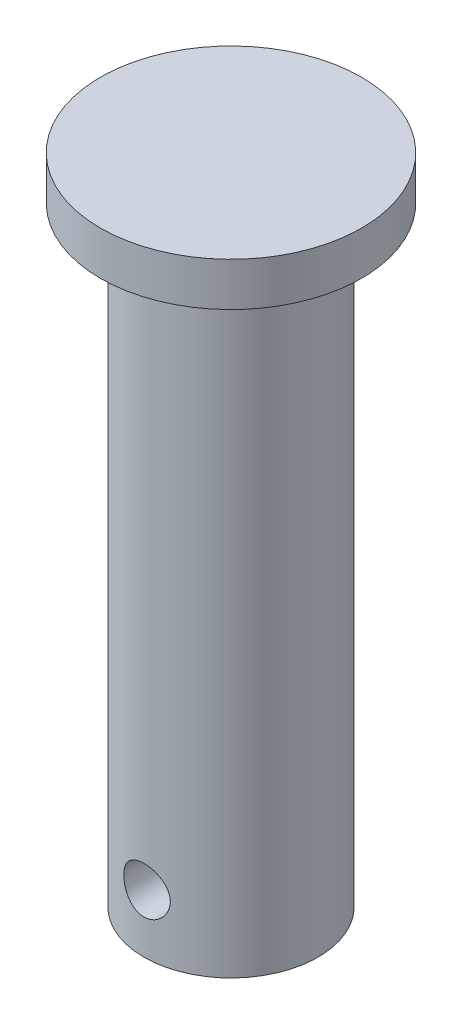
ISO-10303-21;
HEADER;
FILE_DESCRIPTION(('STEP AP214'),'2;1');
FILE_NAME('part.step','',(''),(''),'','','');
FILE_SCHEMA(('AUTOMOTIVE_DESIGN { 1 0 10303 214 1 1 1 1 }'));
ENDSEC;
DATA;
#1=APPLICATION_CONTEXT('core data for automotive mechanical design processes');
#2=APPLICATION_PROTOCOL_DEFINITION('international standard','automotive_design',2000,#1);
#3=PRODUCT_CONTEXT('',#1,'mechanical');
#4=PRODUCT('Part','Part','',(#3));
#5=PRODUCT_RELATED_PRODUCT_CATEGORY('part','',(#4));
#6=PRODUCT_DEFINITION_FORMATION('','',#4);
#7=PRODUCT_DEFINITION_CONTEXT('part definition',#1,'design');
#8=PRODUCT_DEFINITION('design','',#6,#7);
#9=PRODUCT_DEFINITION_SHAPE('','',#8);
#10=(LENGTH_UNIT() NAMED_UNIT(*) SI_UNIT(.MILLI.,.METRE.));
#11=(NAMED_UNIT(*) PLANE_ANGLE_UNIT() SI_UNIT($,.RADIAN.));
#12=(NAMED_UNIT(*) SI_UNIT($,.STERADIAN.) SOLID_ANGLE_UNIT());
#13=UNCERTAINTY_MEASURE_WITH_UNIT(LENGTH_MEASURE(1.E-05),#10,'distance_accuracy_value','');
#14=(GEOMETRIC_REPRESENTATION_CONTEXT(3) GLOBAL_UNCERTAINTY_ASSIGNED_CONTEXT((#13)) GLOBAL_UNIT_ASSIGNED_CONTEXT((#10,
#11,#12)) REPRESENTATION_CONTEXT('',''));
#15=CARTESIAN_POINT('',(0.,0.,0.));
#16=DIRECTION('',(0.,0.,1.));
#17=DIRECTION('',(1.,0.,0.));
#18=AXIS2_PLACEMENT_3D('',#15,#16,#17);
#19=CARTESIAN_POINT('',(0.,42.,0.));
#20=DIRECTION('',(0.,-1.,0.));
#21=DIRECTION('',(0.,0.,-1.));
#22=AXIS2_PLACEMENT_3D('',#19,#20,#21);
#23=CYLINDRICAL_SURFACE('',#22,6.);
#24=CARTESIAN_POINT('',(0.,5.60000000000001,-6.));
#25=CARTESIAN_POINT('',(-0.0882036446662832,5.59999790645213,-5.9999986704813));
#26=CARTESIAN_POINT('',(-0.176429728177472,5.59268190864827,-5.99803588929723));
#27=CARTESIAN_POINT('',(-0.35034036108357,5.56366301540905,-5.99039658897325));
#28=CARTESIAN_POINT('',(-0.436023666655268,5.54195319645911,-5.98471828266059));
#29=CARTESIAN_POINT('',(-0.60231327123625,5.48490266650877,-5.97027466602242));
#30=CARTESIAN_POINT('',(-0.68292596081223,5.44957952986718,-5.96151333704337));
#31=CARTESIAN_POINT('',(-0.837082949114126,5.36637020586672,-5.94182959321305));
#32=CARTESIAN_POINT('',(-0.910626776359695,5.31848318131262,-5.93090703436005));
#33=CARTESIAN_POINT('',(-1.05026360299202,5.21033318686926,-5.90779691921738));
#34=CARTESIAN_POINT('',(-1.11616935189025,5.14983306559322,-5.8955877414348));
#35=CARTESIAN_POINT('',(-1.23702970928508,5.01868121354949,-5.87141927743138));
#36=CARTESIAN_POINT('',(-1.29198290796523,4.94802817790661,-5.85946002355797));
#37=CARTESIAN_POINT('',(-1.39029127394741,4.79708141213901,-5.83692429973529));
#38=CARTESIAN_POINT('',(-1.43343102189222,4.71664293738822,-5.82637510858234));
#39=CARTESIAN_POINT('',(-1.50550038461563,4.54932791112847,-5.80817181846909));
#40=CARTESIAN_POINT('',(-1.53443261960976,4.46245255014382,-5.8005171857408));
#41=CARTESIAN_POINT('',(-1.5766153618114,4.28680356973869,-5.78919292669855));
#42=CARTESIAN_POINT('',(-1.59020536195949,4.19811716803828,-5.78543718352246));
#43=CARTESIAN_POINT('',(-1.60237627764874,4.01964985333367,-5.78207864835752));
#44=CARTESIAN_POINT('',(-1.60095999764589,3.92986914797151,-5.78247508038722));
#45=CARTESIAN_POINT('',(-1.58342808002097,3.7544116677021,-5.78729903015237));
#46=CARTESIAN_POINT('',(-1.56772324851795,3.66869025436957,-5.79161388402151));
#47=CARTESIAN_POINT('',(-1.52271798977763,3.50114533243465,-5.80360810471625));
#48=CARTESIAN_POINT('',(-1.493416475944,3.41932213593963,-5.81128774043996));
#49=CARTESIAN_POINT('',(-1.421714855722,3.26082548495324,-5.82924529396782));
#50=CARTESIAN_POINT('',(-1.37917072910226,3.18422052857102,-5.83955154254446));
#51=CARTESIAN_POINT('',(-1.28229203059023,3.03909267291876,-5.86158583714473));
#52=CARTESIAN_POINT('',(-1.22795513779401,2.97057136867482,-5.8733141628429));
#53=CARTESIAN_POINT('',(-1.10693285810735,2.84120880203617,-5.89734008503746));
#54=CARTESIAN_POINT('',(-1.03990250182639,2.78069094534804,-5.90964377191026));
#55=CARTESIAN_POINT('',(-0.896494134565099,2.67168897571977,-5.93309105021092));
#56=CARTESIAN_POINT('',(-0.820115755364072,2.62320533703806,-5.94423459590854));
#57=CARTESIAN_POINT('',(-0.65967860439796,2.53950567774028,-5.96417456318624));
#58=CARTESIAN_POINT('',(-0.575587922041431,2.50434818364113,-5.97296058266845));
#59=CARTESIAN_POINT('',(-0.402401835512316,2.4487622489493,-5.98712035520802));
#60=CARTESIAN_POINT('',(-0.313307529542659,2.42833058982084,-5.99249485386999));
#61=CARTESIAN_POINT('',(-0.135403266516412,2.40328409846574,-5.99911326846707));
#62=CARTESIAN_POINT('',(-0.0466593901131036,2.39822956811931,-6.00047197976769));
#63=CARTESIAN_POINT('',(0.130408036720959,2.40286653139756,-5.99923577353354));
#64=CARTESIAN_POINT('',(0.218731629649689,2.41255650088461,-5.99664126464274));
#65=CARTESIAN_POINT('',(0.390881959921426,2.44604675796799,-5.98786428396825));
#66=CARTESIAN_POINT('',(0.474759881622232,2.46960179695824,-5.98174421237093));
#67=CARTESIAN_POINT('',(0.637365576940846,2.52986875560634,-5.96661035915282));
#68=CARTESIAN_POINT('',(0.716092791372798,2.56658210100037,-5.9575962639682));
#69=CARTESIAN_POINT('',(0.867870779734386,2.65293910974451,-5.93740528447735));
#70=CARTESIAN_POINT('',(0.94078015076904,2.70282197343847,-5.92618949284386));
#71=CARTESIAN_POINT('',(1.07734770831762,2.81380130412612,-5.9028916189203));
#72=CARTESIAN_POINT('',(1.14100406303899,2.87489998607983,-5.89080936580444));
#73=CARTESIAN_POINT('',(1.25911139583055,3.0086284619967,-5.86671796694981));
#74=CARTESIAN_POINT('',(1.31325215399989,3.08153484912012,-5.85472049149563));
#75=CARTESIAN_POINT('',(1.40853752947959,3.23565175687572,-5.83253157740069));
#76=CARTESIAN_POINT('',(1.44968268897221,3.31686193088299,-5.82234006342218));
#77=CARTESIAN_POINT('',(1.51749929269189,3.48487624567057,-5.80503414721321));
#78=CARTESIAN_POINT('',(1.54425449804718,3.5716446494985,-5.79790198738987));
#79=CARTESIAN_POINT('',(1.58272964096634,3.74867145578706,-5.78751860185751));
#80=CARTESIAN_POINT('',(1.5944534208239,3.83892896029366,-5.78426638438256));
#81=CARTESIAN_POINT('',(1.60231191722602,4.01719583029804,-5.78209395637349));
#82=CARTESIAN_POINT('',(1.59894524494388,4.10518185620422,-5.78303518188826));
#83=CARTESIAN_POINT('',(1.5778750080045,4.27928281121044,-5.78881916870635));
#84=CARTESIAN_POINT('',(1.56017181228047,4.36539778840111,-5.79366182961091));
#85=CARTESIAN_POINT('',(1.51122012559733,4.53268460170324,-5.80662056856999));
#86=CARTESIAN_POINT('',(1.48007728860457,4.61388947418558,-5.81471108015306));
#87=CARTESIAN_POINT('',(1.40521243649916,4.76998306442749,-5.83325454509352));
#88=CARTESIAN_POINT('',(1.36148844819695,4.84487078904045,-5.84370786897202));
#89=CARTESIAN_POINT('',(1.26119127415051,4.98858428759725,-5.86618337152254));
#90=CARTESIAN_POINT('',(1.20427783814327,5.05716682798096,-5.87824266481322));
#91=CARTESIAN_POINT('',(1.0798644280888,5.18396996133388,-5.90236403026437));
#92=CARTESIAN_POINT('',(1.012361883487,5.24218803093508,-5.91442610238761));
#93=CARTESIAN_POINT('',(0.866943984870945,5.34783379011749,-5.93750249923166));
#94=CARTESIAN_POINT('',(0.788836769401421,5.39500400851947,-5.94848889051638));
#95=CARTESIAN_POINT('',(0.62551091233351,5.4754699327435,-5.9678704808232));
#96=CARTESIAN_POINT('',(0.540296875757036,5.50877454053088,-5.97626734146876));
#97=CARTESIAN_POINT('',(0.379499763904791,5.55622022833242,-5.98843802010774));
#98=CARTESIAN_POINT('',(0.304609613252027,5.572599506874,-5.99274216474082));
#99=CARTESIAN_POINT('',(0.15315183625366,5.59448976493365,-5.99852359229165));
#100=CARTESIAN_POINT('',(0.0765843763238879,5.60000181776003,-6.00000115437816));
#101=CARTESIAN_POINT('',(0.,5.60000000000001,-6.));
#102=B_SPLINE_CURVE_WITH_KNOTS('',3,(#24,#25,#26,#27,#28,#29,#30,#31,#32,#33,#34,#35,#36,#37,
#38,#39,#40,#41,#42,#43,#44,#45,#46,#47,#48,#49,#50,#51,#52,#53,#54,#55,#56,#57,#58,#59,#60,#61,
#62,#63,#64,#65,#66,#67,#68,#69,#70,#71,#72,#73,#74,#75,#76,#77,#78,#79,#80,#81,#82,#83,#84,#85,
#86,#87,#88,#89,#90,#91,#92,#93,#94,#95,#96,#97,#98,#99,#100,#101),.UNSPECIFIED.,.T.,.F.,(4,2,2,
2,2,2,2,2,2,2,2,2,2,2,2,2,2,2,2,2,2,2,2,2,2,2,2,2,2,2,2,2,2,2,2,2,2,2,4),(0.,0.264330079159655,
0.528787395009161,0.792904442377547,1.0570390936694,1.32667918363974,1.59635395940119,
1.87066066018583,2.1449167530376,2.41297726598071,2.68098768318787,2.94152801632129,
3.20208917445683,3.4655893867253,3.72914150489435,4.00129007845189,4.27344937545409,
4.54679047677765,4.82007181747443,5.08546174014969,5.35082423135612,5.61162828509024,
5.87246060615823,6.13840228798972,6.40439654602441,6.67789197101562,6.95137598414617,
7.2232503815319,7.49505526923061,7.75794673914764,8.0208314440835,8.28168612350517,
8.54258173690277,8.81115471648986,9.07979299457834,9.35417801816593,9.62838660908019,
9.85791855186544,10.0874278236498),.UNSPECIFIED.);
#103=CARTESIAN_POINT('',(0.,5.60000000000001,-6.));
#104=VERTEX_POINT('',#103);
#105=EDGE_CURVE('E34',#104,#104,#102,.T.);
#106=ORIENTED_EDGE('',*,*,#105,.T.);
#107=EDGE_LOOP('',(#106));
#108=FACE_BOUND('',#107,.T.);
#109=CARTESIAN_POINT('',(1.6,4.,5.78273291792039));
#110=CARTESIAN_POINT('',(1.59999787452612,3.911859249809,5.7827344455633));
#111=CARTESIAN_POINT('',(1.59269194579771,3.82369599961952,5.78477011639344));
#112=CARTESIAN_POINT('',(1.56371666608212,3.64991566275458,5.79266848924472));
#113=CARTESIAN_POINT('',(1.54204010896768,3.56429987601747,5.79853311126453));
#114=CARTESIAN_POINT('',(1.48508676448053,3.39815354404267,5.81337900141366));
#115=CARTESIAN_POINT('',(1.4498291003374,3.31761603293729,5.82235588547335));
#116=CARTESIAN_POINT('',(1.36677427650964,3.16358660795212,5.8424092393635));
#117=CARTESIAN_POINT('',(1.3189761427316,3.09009524199441,5.85348587227547));
#118=CARTESIAN_POINT('',(1.21091878299647,2.95040596240984,5.87680111642766));
#119=CARTESIAN_POINT('',(1.15040238003367,2.88441038602844,5.88906032893152));
#120=CARTESIAN_POINT('',(1.01917941827217,2.76337473843904,5.91318161149208));
#121=CARTESIAN_POINT('',(0.948471804277315,2.70833580308657,5.92504364026752));
#122=CARTESIAN_POINT('',(0.797470536698616,2.60993204927766,5.94726390774734));
#123=CARTESIAN_POINT('',(0.717041455903584,2.56676838509372,5.95759501009834));
#124=CARTESIAN_POINT('',(0.549746435783273,2.4946522917062,5.97535300969467));
#125=CARTESIAN_POINT('',(0.462881584700083,2.46569746617476,5.9827803966101));
#126=CARTESIAN_POINT('',(0.287292769448072,2.42347582381139,5.99374842861169));
#127=CARTESIAN_POINT('',(0.198656979360733,2.40986481869927,5.99737421400212));
#128=CARTESIAN_POINT('',(0.0202908428068608,2.39763430391426,6.000628196942));
#129=CARTESIAN_POINT('',(-0.0694393179508236,2.39901228509589,6.00025706357286));
#130=CARTESIAN_POINT('',(-0.245051389689077,2.41647825003158,5.99562140687813));
#131=CARTESIAN_POINT('',(-0.330973280576888,2.43219436610904,5.99145531221602));
#132=CARTESIAN_POINT('',(-0.498913052456844,2.47728971022556,5.97981398872374));
#133=CARTESIAN_POINT('',(-0.580930710544464,2.50666971734884,5.97233857120463));
#134=CARTESIAN_POINT('',(-0.739683156118043,2.57854387807391,5.95477255279922));
#135=CARTESIAN_POINT('',(-0.816357349063632,2.62116544568057,5.94465670302171));
#136=CARTESIAN_POINT('',(-0.961591999011612,2.71821505560728,5.92289974807569));
#137=CARTESIAN_POINT('',(-1.03015087046869,2.77264539922254,5.91125834578275));
#138=CARTESIAN_POINT('',(-1.15942829557249,2.89374148634714,5.88729018351104));
#139=CARTESIAN_POINT('',(-1.21984153614219,2.96073155603952,5.87495335495478));
#140=CARTESIAN_POINT('',(-1.32865065683815,3.10401974099103,5.85130724018329));
#141=CARTESIAN_POINT('',(-1.37704580423844,3.18031842336025,5.83999801664631));
#142=CARTESIAN_POINT('',(-1.46067743349021,3.34072008145716,5.81964721826454));
#143=CARTESIAN_POINT('',(-1.49583093280429,3.42486828073094,5.81062005680583));
#144=CARTESIAN_POINT('',(-1.55139201348531,3.59818119956357,5.79603460063156));
#145=CARTESIAN_POINT('',(-1.57180325169042,3.68734466915874,5.79047544571885));
#146=CARTESIAN_POINT('',(-1.59677405674218,3.86530176881729,5.78363868515234));
#147=CARTESIAN_POINT('',(-1.60178906096974,3.95402683888858,5.78223810662157));
#148=CARTESIAN_POINT('',(-1.597079848984,4.13104781824198,5.78354062803713));
#149=CARTESIAN_POINT('',(-1.58735720137773,4.21934377219377,5.78624329125356));
#150=CARTESIAN_POINT('',(-1.55385017495931,4.39124527527808,5.79532899431386));
#151=CARTESIAN_POINT('',(-1.53033958330325,4.47490835035109,5.80164031753083));
#152=CARTESIAN_POINT('',(-1.47023189380392,4.63710370508665,5.81716215168585));
#153=CARTESIAN_POINT('',(-1.43363308701324,4.71563531314159,5.82637304120572));
#154=CARTESIAN_POINT('',(-1.34746324406962,4.86724396594853,5.84690857976629));
#155=CARTESIAN_POINT('',(-1.29762476190339,4.94016318071189,5.8582752389782));
#156=CARTESIAN_POINT('',(-1.18672182390013,5.07677064136243,5.88174273547405));
#157=CARTESIAN_POINT('',(-1.12565525778373,5.1404571479633,5.89384371048319));
#158=CARTESIAN_POINT('',(-0.991923026003871,5.25868197859997,5.91783971907433));
#159=CARTESIAN_POINT('',(-0.918973132807077,5.31290270158288,5.92971869219044));
#160=CARTESIAN_POINT('',(-0.764742748752595,5.40832878992841,5.95157336013737));
#161=CARTESIAN_POINT('',(-0.683462701615107,5.44953484806314,5.96154915626333));
#162=CARTESIAN_POINT('',(-0.515451307860697,5.51738370588921,5.978409207194));
#163=CARTESIAN_POINT('',(-0.428766282305868,5.54413521555478,5.98531646784308));
#164=CARTESIAN_POINT('',(-0.251919507785057,5.58263098245149,5.99536243029798));
#165=CARTESIAN_POINT('',(-0.1617585338562,5.59437856541976,5.99850196723977));
#166=CARTESIAN_POINT('',(0.0165136010769242,5.60232465899315,6.0006193075016));
#167=CARTESIAN_POINT('',(0.104602809222309,5.59898905530491,5.99972181030494));
#168=CARTESIAN_POINT('',(0.278918643704556,5.57794520513986,5.9941479278306));
#169=CARTESIAN_POINT('',(0.365145339850183,5.56023749830647,5.98947168443723));
#170=CARTESIAN_POINT('',(0.532728098771435,5.51121551606502,5.97689048312844));
#171=CARTESIAN_POINT('',(0.614113609481483,5.47999576522168,5.96900797751776));
#172=CARTESIAN_POINT('',(0.770537678776832,5.40492031860339,5.95083853212803));
#173=CARTESIAN_POINT('',(0.845575345328785,5.36106285071116,5.9405512551794));
#174=CARTESIAN_POINT('',(0.989342614939896,5.26059338228894,5.91833064980799));
#175=CARTESIAN_POINT('',(1.05785068939027,5.20367249543562,5.90636074702983));
#176=CARTESIAN_POINT('',(1.18450029724544,5.07927780051353,5.88227200056129));
#177=CARTESIAN_POINT('',(1.24263909793084,5.0118012193649,5.87015311850574));
#178=CARTESIAN_POINT('',(1.34816560187261,4.86642528332749,5.84683167732792));
#179=CARTESIAN_POINT('',(1.39528875413901,4.7883293490008,5.83565513061492));
#180=CARTESIAN_POINT('',(1.47566951228968,4.6250349512375,5.81585115203583));
#181=CARTESIAN_POINT('',(1.50893618695116,4.53984117714822,5.80722205399804));
#182=CARTESIAN_POINT('',(1.55630499401031,4.37913493117279,5.79468800506476));
#183=CARTESIAN_POINT('',(1.57265214719335,4.30431898835834,5.79024112213281));
#184=CARTESIAN_POINT('',(1.59449995435361,4.15300755360112,5.78426308173731));
#185=CARTESIAN_POINT('',(1.60000184505801,4.07651225416789,5.78273159182091));
#186=CARTESIAN_POINT('',(1.6,4.,5.78273291792039));
#187=B_SPLINE_CURVE_WITH_KNOTS('',3,(#109,#110,#111,#112,#113,#114,#115,#116,#117,#118,#119,
#120,#121,#122,#123,#124,#125,#126,#127,#128,#129,#130,#131,#132,#133,#134,#135,#136,#137,#138,
#139,#140,#141,#142,#143,#144,#145,#146,#147,#148,#149,#150,#151,#152,#153,#154,#155,#156,#157,
#158,#159,#160,#161,#162,#163,#164,#165,#166,#167,#168,#169,#170,#171,#172,#173,#174,#175,#176,
#177,#178,#179,#180,#181,#182,#183,#184,#185,#186),.UNSPECIFIED.,.T.,.F.,(4,2,2,2,2,2,2,2,2,2,2,
2,2,2,2,2,2,2,2,2,2,2,2,2,2,2,2,2,2,2,2,2,2,2,2,2,2,2,4),(0.,0.264140902492821,
0.528414358280161,0.792317049276935,1.05624024524884,1.32612732904169,1.59604237699569,
1.87028165896643,2.14447467443397,2.41238643453184,2.68025334708482,2.94136456640643,
3.20249067552556,3.46621159124456,3.72998394715593,4.00185409840264,4.27374082111663,
4.54730412077229,4.82079953934806,5.08612267391536,5.35141757070658,5.61161480341915,
5.87184602287714,6.13779707970073,6.40379817229035,6.67748725563562,6.95116176802338,
7.22274831668976,7.4942746556306,7.75747243929026,8.02066034086225,8.28203611890788,
8.54344856608626,8.81183083189117,9.08028372300693,9.35464031183427,9.6288170567485,
9.85813574131029,10.0874282742632),.UNSPECIFIED.);
#188=CARTESIAN_POINT('',(1.6,4.,5.78273291792039));
#189=VERTEX_POINT('',#188);
#190=EDGE_CURVE('E51',#189,#189,#187,.T.);
#191=ORIENTED_EDGE('',*,*,#190,.T.);
#192=EDGE_LOOP('',(#191));
#193=FACE_BOUND('',#192,.T.);
#194=CARTESIAN_POINT('',(0.,42.,0.));
#195=DIRECTION('',(0.,1.,0.));
#196=DIRECTION('',(0.,0.,1.));
#197=AXIS2_PLACEMENT_3D('',#194,#195,#196);
#198=CIRCLE('',#197,6.);
#199=CARTESIAN_POINT('',(0.,42.,6.));
#200=VERTEX_POINT('',#199);
#201=EDGE_CURVE('E10',#200,#200,#198,.T.);
#202=ORIENTED_EDGE('',*,*,#201,.F.);
#203=EDGE_LOOP('',(#202));
#204=FACE_BOUND('',#203,.T.);
#205=CARTESIAN_POINT('',(0.,0.,0.));
#206=DIRECTION('',(0.,1.,0.));
#207=DIRECTION('',(0.,0.,1.));
#208=AXIS2_PLACEMENT_3D('',#205,#206,#207);
#209=CIRCLE('',#208,6.);
#210=CARTESIAN_POINT('',(0.,0.,6.));
#211=VERTEX_POINT('',#210);
#212=EDGE_CURVE('E41',#211,#211,#209,.T.);
#213=ORIENTED_EDGE('',*,*,#212,.T.);
#214=EDGE_LOOP('',(#213));
#215=FACE_BOUND('',#214,.T.);
#216=ADVANCED_FACE('F30',(#108,#193,#204,#215),#23,.T.);
#217=CARTESIAN_POINT('',(0.,0.,0.));
#218=DIRECTION('',(0.,1.,0.));
#219=DIRECTION('',(0.,0.,1.));
#220=AXIS2_PLACEMENT_3D('',#217,#218,#219);
#221=PLANE('',#220);
#222=ORIENTED_EDGE('',*,*,#212,.F.);
#223=EDGE_LOOP('',(#222));
#224=FACE_BOUND('',#223,.T.);
#225=ADVANCED_FACE('F70',(#224),#221,.F.);
#226=CARTESIAN_POINT('',(0.,45.,0.));
#227=DIRECTION('',(0.,-1.,0.));
#228=DIRECTION('',(0.,0.,-1.));
#229=AXIS2_PLACEMENT_3D('',#226,#227,#228);
#230=CYLINDRICAL_SURFACE('',#229,9.);
#231=CARTESIAN_POINT('',(0.,45.,0.));
#232=DIRECTION('',(0.,1.,0.));
#233=DIRECTION('',(0.,0.,1.));
#234=AXIS2_PLACEMENT_3D('',#231,#232,#233);
#235=CIRCLE('',#234,9.);
#236=CARTESIAN_POINT('',(0.,45.,9.));
#237=VERTEX_POINT('',#236);
#238=EDGE_CURVE('E46',#237,#237,#235,.T.);
#239=ORIENTED_EDGE('',*,*,#238,.F.);
#240=EDGE_LOOP('',(#239));
#241=FACE_BOUND('',#240,.T.);
#242=CARTESIAN_POINT('',(0.,42.,0.));
#243=DIRECTION('',(0.,1.,0.));
#244=DIRECTION('',(0.,0.,1.));
#245=AXIS2_PLACEMENT_3D('',#242,#243,#244);
#246=CIRCLE('',#245,9.);
#247=CARTESIAN_POINT('',(0.,42.,9.));
#248=VERTEX_POINT('',#247);
#249=EDGE_CURVE('E49',#248,#248,#246,.T.);
#250=ORIENTED_EDGE('',*,*,#249,.T.);
#251=EDGE_LOOP('',(#250));
#252=FACE_BOUND('',#251,.T.);
#253=ADVANCED_FACE('F65',(#241,#252),#230,.T.);
#254=CARTESIAN_POINT('',(0.,45.,0.));
#255=DIRECTION('',(0.,1.,0.));
#256=DIRECTION('',(0.,0.,1.));
#257=AXIS2_PLACEMENT_3D('',#254,#255,#256);
#258=PLANE('',#257);
#259=ORIENTED_EDGE('',*,*,#238,.T.);
#260=EDGE_LOOP('',(#259));
#261=FACE_BOUND('',#260,.T.);
#262=ADVANCED_FACE('F61',(#261),#258,.T.);
#263=CARTESIAN_POINT('',(0.,42.,0.));
#264=DIRECTION('',(0.,1.,0.));
#265=DIRECTION('',(0.,0.,1.));
#266=AXIS2_PLACEMENT_3D('',#263,#264,#265);
#267=PLANE('',#266);
#268=ORIENTED_EDGE('',*,*,#201,.T.);
#269=EDGE_LOOP('',(#268));
#270=FACE_BOUND('',#269,.T.);
#271=ORIENTED_EDGE('',*,*,#249,.F.);
#272=EDGE_LOOP('',(#271));
#273=FACE_BOUND('',#272,.T.);
#274=ADVANCED_FACE('F59',(#270,#273),#267,.F.);
#275=CARTESIAN_POINT('',(0.,4.,-9.));
#276=DIRECTION('',(0.,0.,1.));
#277=DIRECTION('',(1.,0.,0.));
#278=AXIS2_PLACEMENT_3D('',#275,#276,#277);
#279=CYLINDRICAL_SURFACE('',#278,1.6);
#280=ORIENTED_EDGE('',*,*,#190,.F.);
#281=EDGE_LOOP('',(#280));
#282=FACE_BOUND('',#281,.T.);
#283=ORIENTED_EDGE('',*,*,#105,.F.);
#284=EDGE_LOOP('',(#283));
#285=FACE_BOUND('',#284,.T.);
#286=ADVANCED_FACE('F55',(#282,#285),#279,.F.);
#287=CLOSED_SHELL('',(#216,#225,#253,#262,#274,#286));
#288=MANIFOLD_SOLID_BREP('B2',#287);
#289=ADVANCED_BREP_SHAPE_REPRESENTATION('',(#18,#288),#14);
#290=SHAPE_DEFINITION_REPRESENTATION(#9,#289);
ENDSEC;
END-ISO-10303-21;
